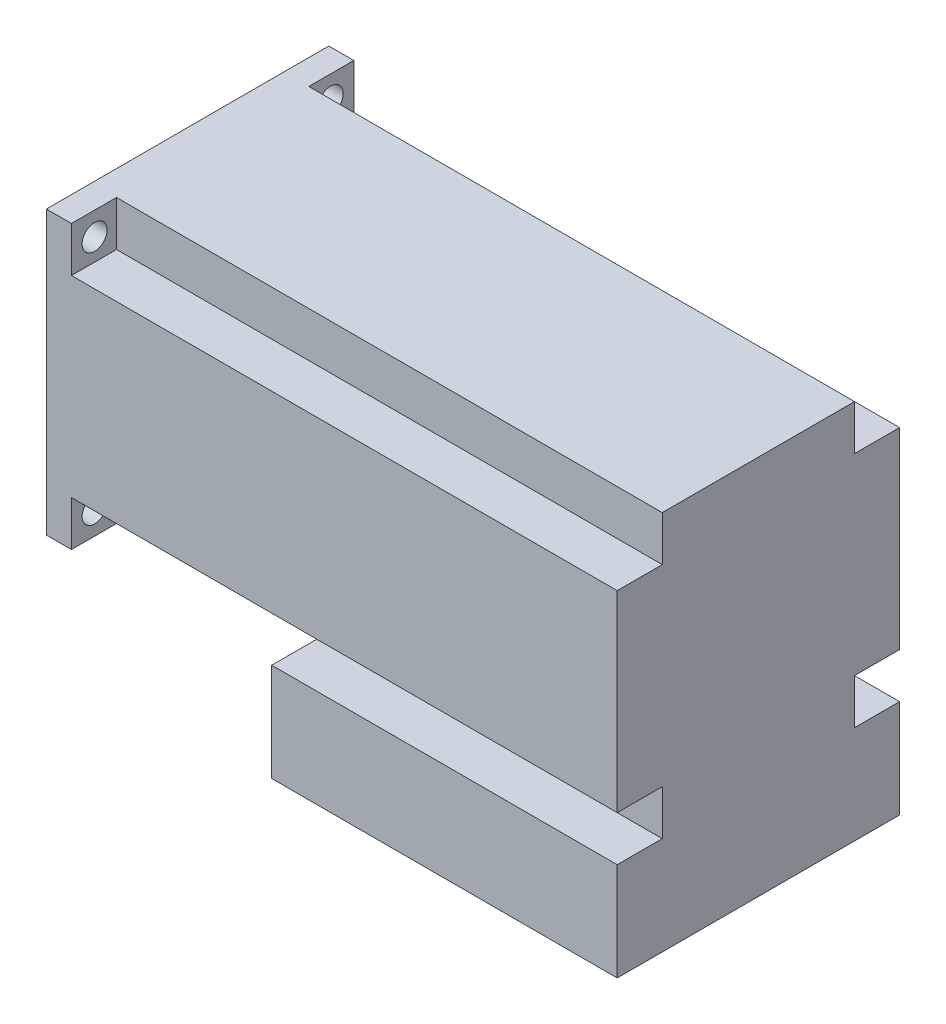
ISO-10303-21;
HEADER;
FILE_DESCRIPTION(('STEP AP214'),'2;1');
FILE_NAME('part.step','',(''),(''),'','','');
FILE_SCHEMA(('AUTOMOTIVE_DESIGN { 1 0 10303 214 1 1 1 1 }'));
ENDSEC;
DATA;
#1=APPLICATION_CONTEXT('core data for automotive mechanical design processes');
#2=APPLICATION_PROTOCOL_DEFINITION('international standard','automotive_design',2000,#1);
#3=PRODUCT_CONTEXT('',#1,'mechanical');
#4=PRODUCT('Part','Part','',(#3));
#5=PRODUCT_RELATED_PRODUCT_CATEGORY('part','',(#4));
#6=PRODUCT_DEFINITION_FORMATION('','',#4);
#7=PRODUCT_DEFINITION_CONTEXT('part definition',#1,'design');
#8=PRODUCT_DEFINITION('design','',#6,#7);
#9=PRODUCT_DEFINITION_SHAPE('','',#8);
#10=(LENGTH_UNIT() NAMED_UNIT(*) SI_UNIT(.MILLI.,.METRE.));
#11=(NAMED_UNIT(*) PLANE_ANGLE_UNIT() SI_UNIT($,.RADIAN.));
#12=(NAMED_UNIT(*) SI_UNIT($,.STERADIAN.) SOLID_ANGLE_UNIT());
#13=UNCERTAINTY_MEASURE_WITH_UNIT(LENGTH_MEASURE(1.E-05),#10,'distance_accuracy_value','');
#14=(GEOMETRIC_REPRESENTATION_CONTEXT(3) GLOBAL_UNCERTAINTY_ASSIGNED_CONTEXT((#13)) GLOBAL_UNIT_ASSIGNED_CONTEXT((#10,
#11,#12)) REPRESENTATION_CONTEXT('',''));
#15=CARTESIAN_POINT('',(0.,0.,0.));
#16=DIRECTION('',(0.,0.,1.));
#17=DIRECTION('',(1.,0.,0.));
#18=AXIS2_PLACEMENT_3D('',#15,#16,#17);
#19=CARTESIAN_POINT('',(0.,0.,56.4));
#20=DIRECTION('',(0.,0.,-1.));
#21=DIRECTION('',(-1.,0.,0.));
#22=AXIS2_PLACEMENT_3D('',#19,#20,#21);
#23=PLANE('',#22);
#24=DIRECTION('',(0.,1.,0.));
#25=VECTOR('',#24,1.);
#26=CARTESIAN_POINT('',(114.,-19.6,56.4));
#27=LINE('',#26,#25);
#28=CARTESIAN_POINT('',(114.,-19.6,56.4));
#29=VERTEX_POINT('',#28);
#30=CARTESIAN_POINT('',(114.,0.,56.3999999999995));
#31=VERTEX_POINT('',#30);
#32=EDGE_CURVE('E379',#29,#31,#27,.T.);
#33=ORIENTED_EDGE('',*,*,#32,.T.);
#34=DIRECTION('',(-1.,0.,0.));
#35=VECTOR('',#34,1.);
#36=CARTESIAN_POINT('',(0.,0.,56.4));
#37=LINE('',#36,#35);
#38=CARTESIAN_POINT('',(45.,0.,56.3999999999995));
#39=VERTEX_POINT('',#38);
#40=EDGE_CURVE('E11',#31,#39,#37,.T.);
#41=ORIENTED_EDGE('',*,*,#40,.T.);
#42=DIRECTION('',(0.,-1.,0.));
#43=VECTOR('',#42,1.);
#44=CARTESIAN_POINT('',(45.,0.,56.4));
#45=LINE('',#44,#43);
#46=CARTESIAN_POINT('',(45.,-19.6,56.4));
#47=VERTEX_POINT('',#46);
#48=EDGE_CURVE('E372',#39,#47,#45,.T.);
#49=ORIENTED_EDGE('',*,*,#48,.T.);
#50=DIRECTION('',(1.,0.,0.));
#51=VECTOR('',#50,1.);
#52=CARTESIAN_POINT('',(45.,-19.6,56.4));
#53=LINE('',#52,#51);
#54=EDGE_CURVE('E375',#47,#29,#53,.T.);
#55=ORIENTED_EDGE('',*,*,#54,.T.);
#56=EDGE_LOOP('',(#33,#41,#49,#55));
#57=FACE_BOUND('',#56,.T.);
#58=ADVANCED_FACE('F39',(#57),#23,.F.);
#59=CARTESIAN_POINT('',(0.,0.,0.));
#60=DIRECTION('',(0.,0.,-1.));
#61=DIRECTION('',(-1.,0.,0.));
#62=AXIS2_PLACEMENT_3D('',#59,#60,#61);
#63=PLANE('',#62);
#64=DIRECTION('',(-1.,0.,0.));
#65=VECTOR('',#64,1.);
#66=CARTESIAN_POINT('',(0.,0.,0.));
#67=LINE('',#66,#65);
#68=CARTESIAN_POINT('',(114.,0.,-4.92661467177413E-13));
#69=VERTEX_POINT('',#68);
#70=CARTESIAN_POINT('',(45.,0.,-4.92661467177413E-13));
#71=VERTEX_POINT('',#70);
#72=EDGE_CURVE('E48',#69,#71,#67,.T.);
#73=ORIENTED_EDGE('',*,*,#72,.F.);
#74=DIRECTION('',(0.,1.,0.));
#75=VECTOR('',#74,1.);
#76=CARTESIAN_POINT('',(114.,0.,0.));
#77=LINE('',#76,#75);
#78=CARTESIAN_POINT('',(114.,-19.6,0.));
#79=VERTEX_POINT('',#78);
#80=EDGE_CURVE('E402',#79,#69,#77,.T.);
#81=ORIENTED_EDGE('',*,*,#80,.F.);
#82=DIRECTION('',(1.,0.,0.));
#83=VECTOR('',#82,1.);
#84=CARTESIAN_POINT('',(45.,-19.6,0.));
#85=LINE('',#84,#83);
#86=CARTESIAN_POINT('',(45.,-19.6,0.));
#87=VERTEX_POINT('',#86);
#88=EDGE_CURVE('E397',#87,#79,#85,.T.);
#89=ORIENTED_EDGE('',*,*,#88,.F.);
#90=DIRECTION('',(0.,-1.,0.));
#91=VECTOR('',#90,1.);
#92=CARTESIAN_POINT('',(45.,0.,0.));
#93=LINE('',#92,#91);
#94=EDGE_CURVE('E394',#71,#87,#93,.T.);
#95=ORIENTED_EDGE('',*,*,#94,.F.);
#96=EDGE_LOOP('',(#73,#81,#89,#95));
#97=FACE_BOUND('',#96,.T.);
#98=ADVANCED_FACE('F447',(#97),#63,.T.);
#99=CARTESIAN_POINT('',(0.,0.,56.4));
#100=DIRECTION('',(1.,0.,0.));
#101=DIRECTION('',(0.,0.,-1.));
#102=AXIS2_PLACEMENT_3D('',#99,#100,#101);
#103=PLANE('',#102);
#104=CARTESIAN_POINT('',(0.,28.2,28.2));
#105=DIRECTION('',(1.,0.,0.));
#106=DIRECTION('',(0.,0.,-1.));
#107=AXIS2_PLACEMENT_3D('',#104,#105,#106);
#108=CIRCLE('',#107,3.175);
#109=CARTESIAN_POINT('',(0.,28.2,25.025));
#110=VERTEX_POINT('',#109);
#111=EDGE_CURVE('E430',#110,#110,#108,.F.);
#112=ORIENTED_EDGE('',*,*,#111,.F.);
#113=EDGE_LOOP('',(#112));
#114=FACE_BOUND('',#113,.T.);
#115=CARTESIAN_POINT('',(0.,51.77,4.62999999999984));
#116=DIRECTION('',(-1.,0.,0.));
#117=DIRECTION('',(0.,0.,1.));
#118=AXIS2_PLACEMENT_3D('',#115,#116,#117);
#119=CIRCLE('',#118,2.5);
#120=CARTESIAN_POINT('',(0.,51.77,7.12999999999984));
#121=VERTEX_POINT('',#120);
#122=EDGE_CURVE('E333',#121,#121,#119,.T.);
#123=ORIENTED_EDGE('',*,*,#122,.F.);
#124=EDGE_LOOP('',(#123));
#125=FACE_BOUND('',#124,.T.);
#126=CARTESIAN_POINT('',(0.,51.77,51.7699999999998));
#127=DIRECTION('',(-1.,0.,0.));
#128=DIRECTION('',(0.,0.,1.));
#129=AXIS2_PLACEMENT_3D('',#126,#127,#128);
#130=CIRCLE('',#129,2.5);
#131=CARTESIAN_POINT('',(0.,51.77,54.2699999999998));
#132=VERTEX_POINT('',#131);
#133=EDGE_CURVE('E343',#132,#132,#130,.T.);
#134=ORIENTED_EDGE('',*,*,#133,.F.);
#135=EDGE_LOOP('',(#134));
#136=FACE_BOUND('',#135,.T.);
#137=CARTESIAN_POINT('',(0.,4.63,51.77));
#138=DIRECTION('',(-1.,0.,0.));
#139=DIRECTION('',(0.,0.,1.));
#140=AXIS2_PLACEMENT_3D('',#137,#138,#139);
#141=CIRCLE('',#140,2.5);
#142=CARTESIAN_POINT('',(0.,4.63,54.27));
#143=VERTEX_POINT('',#142);
#144=EDGE_CURVE('E338',#143,#143,#141,.T.);
#145=ORIENTED_EDGE('',*,*,#144,.F.);
#146=EDGE_LOOP('',(#145));
#147=FACE_BOUND('',#146,.T.);
#148=CARTESIAN_POINT('',(0.,4.63,4.63));
#149=DIRECTION('',(-1.,0.,0.));
#150=DIRECTION('',(0.,0.,1.));
#151=AXIS2_PLACEMENT_3D('',#148,#149,#150);
#152=CIRCLE('',#151,2.5);
#153=CARTESIAN_POINT('',(0.,4.63,7.13000000000001));
#154=VERTEX_POINT('',#153);
#155=EDGE_CURVE('E342',#154,#154,#152,.T.);
#156=ORIENTED_EDGE('',*,*,#155,.F.);
#157=EDGE_LOOP('',(#156));
#158=FACE_BOUND('',#157,.T.);
#159=DIRECTION('',(0.,-1.,0.));
#160=VECTOR('',#159,1.);
#161=CARTESIAN_POINT('',(0.,0.,0.));
#162=LINE('',#161,#160);
#163=CARTESIAN_POINT('',(0.,56.4,0.));
#164=VERTEX_POINT('',#163);
#165=CARTESIAN_POINT('',(0.,0.,0.));
#166=VERTEX_POINT('',#165);
#167=EDGE_CURVE('E362',#164,#166,#162,.T.);
#168=ORIENTED_EDGE('',*,*,#167,.T.);
#169=DIRECTION('',(0.,0.,-1.));
#170=VECTOR('',#169,1.);
#171=CARTESIAN_POINT('',(0.,0.,56.4));
#172=LINE('',#171,#170);
#173=CARTESIAN_POINT('',(0.,0.,56.4));
#174=VERTEX_POINT('',#173);
#175=EDGE_CURVE('E426',#174,#166,#172,.T.);
#176=ORIENTED_EDGE('',*,*,#175,.F.);
#177=DIRECTION('',(0.,-1.,0.));
#178=VECTOR('',#177,1.);
#179=CARTESIAN_POINT('',(0.,0.,56.4));
#180=LINE('',#179,#178);
#181=CARTESIAN_POINT('',(0.,56.4,56.4));
#182=VERTEX_POINT('',#181);
#183=EDGE_CURVE('E363',#182,#174,#180,.T.);
#184=ORIENTED_EDGE('',*,*,#183,.F.);
#185=DIRECTION('',(0.,0.,-1.));
#186=VECTOR('',#185,1.);
#187=CARTESIAN_POINT('',(0.,56.4,56.4));
#188=LINE('',#187,#186);
#189=EDGE_CURVE('E386',#182,#164,#188,.T.);
#190=ORIENTED_EDGE('',*,*,#189,.T.);
#191=EDGE_LOOP('',(#168,#176,#184,#190));
#192=FACE_BOUND('',#191,.T.);
#193=ADVANCED_FACE('F41',(#114,#125,#136,#147,#158,#192),#103,.F.);
#194=CARTESIAN_POINT('',(0.,0.,56.4));
#195=DIRECTION('',(0.,1.,0.));
#196=DIRECTION('',(0.,0.,1.));
#197=AXIS2_PLACEMENT_3D('',#194,#195,#196);
#198=PLANE('',#197);
#199=DIRECTION('',(0.,0.,-1.));
#200=VECTOR('',#199,1.);
#201=CARTESIAN_POINT('',(45.,0.,56.4));
#202=LINE('',#201,#200);
#203=CARTESIAN_POINT('',(45.,0.,47.3999999999995));
#204=VERTEX_POINT('',#203);
#205=CARTESIAN_POINT('',(45.,0.,8.99999999999951));
#206=VERTEX_POINT('',#205);
#207=EDGE_CURVE('E421',#204,#206,#202,.T.);
#208=ORIENTED_EDGE('',*,*,#207,.F.);
#209=DIRECTION('',(1.,0.,0.));
#210=VECTOR('',#209,1.);
#211=CARTESIAN_POINT('',(5.,0.,47.3999999999995));
#212=LINE('',#211,#210);
#213=CARTESIAN_POINT('',(5.,0.,47.3999999999995));
#214=VERTEX_POINT('',#213);
#215=EDGE_CURVE('E286',#214,#204,#212,.T.);
#216=ORIENTED_EDGE('',*,*,#215,.F.);
#217=DIRECTION('',(0.,0.,-1.));
#218=VECTOR('',#217,1.);
#219=CARTESIAN_POINT('',(5.,0.,56.3999999999995));
#220=LINE('',#219,#218);
#221=CARTESIAN_POINT('',(5.,0.,56.3999999999995));
#222=VERTEX_POINT('',#221);
#223=EDGE_CURVE('E267',#222,#214,#220,.T.);
#224=ORIENTED_EDGE('',*,*,#223,.F.);
#225=DIRECTION('',(1.,0.,0.));
#226=VECTOR('',#225,1.);
#227=CARTESIAN_POINT('',(0.,0.,56.4));
#228=LINE('',#227,#226);
#229=EDGE_CURVE('E367',#174,#222,#228,.T.);
#230=ORIENTED_EDGE('',*,*,#229,.F.);
#231=ORIENTED_EDGE('',*,*,#175,.T.);
#232=DIRECTION('',(1.,0.,0.));
#233=VECTOR('',#232,1.);
#234=CARTESIAN_POINT('',(0.,0.,0.));
#235=LINE('',#234,#233);
#236=CARTESIAN_POINT('',(5.,0.,0.));
#237=VERTEX_POINT('',#236);
#238=EDGE_CURVE('E390',#166,#237,#235,.T.);
#239=ORIENTED_EDGE('',*,*,#238,.T.);
#240=DIRECTION('',(0.,0.,-1.));
#241=VECTOR('',#240,1.);
#242=CARTESIAN_POINT('',(5.,0.,8.99999999999951));
#243=LINE('',#242,#241);
#244=CARTESIAN_POINT('',(5.,0.,8.99999999999951));
#245=VERTEX_POINT('',#244);
#246=EDGE_CURVE('E231',#245,#237,#243,.T.);
#247=ORIENTED_EDGE('',*,*,#246,.F.);
#248=DIRECTION('',(1.,0.,0.));
#249=VECTOR('',#248,1.);
#250=CARTESIAN_POINT('',(5.,0.,8.99999999999951));
#251=LINE('',#250,#249);
#252=EDGE_CURVE('E254',#245,#206,#251,.T.);
#253=ORIENTED_EDGE('',*,*,#252,.T.);
#254=EDGE_LOOP('',(#208,#216,#224,#230,#231,#239,#247,#253));
#255=FACE_BOUND('',#254,.T.);
#256=ADVANCED_FACE('F469',(#255),#198,.F.);
#257=CARTESIAN_POINT('',(45.,0.,56.4));
#258=DIRECTION('',(1.,0.,0.));
#259=DIRECTION('',(0.,0.,-1.));
#260=AXIS2_PLACEMENT_3D('',#257,#258,#259);
#261=PLANE('',#260);
#262=ORIENTED_EDGE('',*,*,#94,.T.);
#263=DIRECTION('',(0.,0.,-1.));
#264=VECTOR('',#263,1.);
#265=CARTESIAN_POINT('',(45.,-19.6,56.4));
#266=LINE('',#265,#264);
#267=EDGE_CURVE('E417',#47,#87,#266,.T.);
#268=ORIENTED_EDGE('',*,*,#267,.F.);
#269=ORIENTED_EDGE('',*,*,#48,.F.);
#270=EDGE_CURVE('E422',#39,#204,#202,.T.);
#271=ORIENTED_EDGE('',*,*,#270,.T.);
#272=ORIENTED_EDGE('',*,*,#207,.T.);
#273=DIRECTION('',(0.,0.,-1.));
#274=VECTOR('',#273,1.);
#275=CARTESIAN_POINT('',(45.,0.,56.4));
#276=LINE('',#275,#274);
#277=EDGE_CURVE('E323',#206,#71,#276,.T.);
#278=ORIENTED_EDGE('',*,*,#277,.T.);
#279=EDGE_LOOP('',(#262,#268,#269,#271,#272,#278));
#280=FACE_BOUND('',#279,.T.);
#281=ADVANCED_FACE('F443',(#280),#261,.F.);
#282=CARTESIAN_POINT('',(45.,-19.6,56.4));
#283=DIRECTION('',(0.,1.,0.));
#284=DIRECTION('',(0.,0.,1.));
#285=AXIS2_PLACEMENT_3D('',#282,#283,#284);
#286=PLANE('',#285);
#287=ORIENTED_EDGE('',*,*,#88,.T.);
#288=DIRECTION('',(0.,0.,-1.));
#289=VECTOR('',#288,1.);
#290=CARTESIAN_POINT('',(114.,-19.6,56.4));
#291=LINE('',#290,#289);
#292=EDGE_CURVE('E413',#29,#79,#291,.T.);
#293=ORIENTED_EDGE('',*,*,#292,.F.);
#294=ORIENTED_EDGE('',*,*,#54,.F.);
#295=ORIENTED_EDGE('',*,*,#267,.T.);
#296=EDGE_LOOP('',(#287,#293,#294,#295));
#297=FACE_BOUND('',#296,.T.);
#298=ADVANCED_FACE('F450',(#297),#286,.F.);
#299=CARTESIAN_POINT('',(114.,0.,56.4));
#300=DIRECTION('',(-1.,0.,0.));
#301=DIRECTION('',(0.,0.,1.));
#302=AXIS2_PLACEMENT_3D('',#299,#300,#301);
#303=PLANE('',#302);
#304=CARTESIAN_POINT('',(114.,9.,56.3999999999995));
#305=VERTEX_POINT('',#304);
#306=CARTESIAN_POINT('',(114.,47.4,56.4));
#307=VERTEX_POINT('',#306);
#308=EDGE_CURVE('E378',#305,#307,#27,.T.);
#309=ORIENTED_EDGE('',*,*,#308,.F.);
#310=DIRECTION('',(0.,0.,1.));
#311=VECTOR('',#310,1.);
#312=CARTESIAN_POINT('',(114.,9.,56.3999999999995));
#313=LINE('',#312,#311);
#314=CARTESIAN_POINT('',(114.,9.,47.3999999999995));
#315=VERTEX_POINT('',#314);
#316=EDGE_CURVE('E274',#315,#305,#313,.T.);
#317=ORIENTED_EDGE('',*,*,#316,.F.);
#318=DIRECTION('',(0.,1.,0.));
#319=VECTOR('',#318,1.);
#320=CARTESIAN_POINT('',(114.,9.,47.3999999999995));
#321=LINE('',#320,#319);
#322=CARTESIAN_POINT('',(114.,0.,47.3999999999995));
#323=VERTEX_POINT('',#322);
#324=EDGE_CURVE('E264',#323,#315,#321,.T.);
#325=ORIENTED_EDGE('',*,*,#324,.F.);
#326=DIRECTION('',(0.,0.,-1.));
#327=VECTOR('',#326,1.);
#328=CARTESIAN_POINT('',(114.,0.,56.3999999999995));
#329=LINE('',#328,#327);
#330=EDGE_CURVE('E277',#31,#323,#329,.T.);
#331=ORIENTED_EDGE('',*,*,#330,.F.);
#332=ORIENTED_EDGE('',*,*,#32,.F.);
#333=ORIENTED_EDGE('',*,*,#292,.T.);
#334=ORIENTED_EDGE('',*,*,#80,.T.);
#335=DIRECTION('',(0.,0.,-1.));
#336=VECTOR('',#335,1.);
#337=CARTESIAN_POINT('',(114.,0.,8.99999999999951));
#338=LINE('',#337,#336);
#339=CARTESIAN_POINT('',(114.,0.,8.99999999999951));
#340=VERTEX_POINT('',#339);
#341=EDGE_CURVE('E227',#340,#69,#338,.T.);
#342=ORIENTED_EDGE('',*,*,#341,.F.);
#343=DIRECTION('',(0.,-1.,0.));
#344=VECTOR('',#343,1.);
#345=CARTESIAN_POINT('',(114.,9.,8.99999999999951));
#346=LINE('',#345,#344);
#347=CARTESIAN_POINT('',(114.,9.,8.99999999999951));
#348=VERTEX_POINT('',#347);
#349=EDGE_CURVE('E243',#348,#340,#346,.T.);
#350=ORIENTED_EDGE('',*,*,#349,.F.);
#351=DIRECTION('',(0.,0.,1.));
#352=VECTOR('',#351,1.);
#353=CARTESIAN_POINT('',(114.,9.,8.99999999999951));
#354=LINE('',#353,#352);
#355=CARTESIAN_POINT('',(114.,9.,-4.92661467177413E-13));
#356=VERTEX_POINT('',#355);
#357=EDGE_CURVE('E239',#356,#348,#354,.T.);
#358=ORIENTED_EDGE('',*,*,#357,.F.);
#359=CARTESIAN_POINT('',(114.,47.4,0.));
#360=VERTEX_POINT('',#359);
#361=EDGE_CURVE('E401',#356,#360,#77,.T.);
#362=ORIENTED_EDGE('',*,*,#361,.T.);
#363=DIRECTION('',(0.,0.,-1.));
#364=VECTOR('',#363,1.);
#365=CARTESIAN_POINT('',(114.,47.4,9.));
#366=LINE('',#365,#364);
#367=CARTESIAN_POINT('',(114.,47.4,9.));
#368=VERTEX_POINT('',#367);
#369=EDGE_CURVE('E206',#368,#360,#366,.T.);
#370=ORIENTED_EDGE('',*,*,#369,.F.);
#371=DIRECTION('',(0.,-1.,0.));
#372=VECTOR('',#371,1.);
#373=CARTESIAN_POINT('',(114.,56.4,9.));
#374=LINE('',#373,#372);
#375=CARTESIAN_POINT('',(114.,56.4,9.));
#376=VERTEX_POINT('',#375);
#377=EDGE_CURVE('E253',#376,#368,#374,.T.);
#378=ORIENTED_EDGE('',*,*,#377,.F.);
#379=DIRECTION('',(0.,0.,-1.));
#380=VECTOR('',#379,1.);
#381=CARTESIAN_POINT('',(114.,56.4,56.4));
#382=LINE('',#381,#380);
#383=CARTESIAN_POINT('',(114.,56.4,47.4));
#384=VERTEX_POINT('',#383);
#385=EDGE_CURVE('E212',#384,#376,#382,.T.);
#386=ORIENTED_EDGE('',*,*,#385,.F.);
#387=DIRECTION('',(0.,1.,0.));
#388=VECTOR('',#387,1.);
#389=CARTESIAN_POINT('',(114.,56.4,47.4));
#390=LINE('',#389,#388);
#391=CARTESIAN_POINT('',(114.,47.4,47.4));
#392=VERTEX_POINT('',#391);
#393=EDGE_CURVE('E298',#392,#384,#390,.T.);
#394=ORIENTED_EDGE('',*,*,#393,.F.);
#395=DIRECTION('',(0.,0.,-1.));
#396=VECTOR('',#395,1.);
#397=CARTESIAN_POINT('',(114.,47.4,56.4));
#398=LINE('',#397,#396);
#399=EDGE_CURVE('E308',#307,#392,#398,.T.);
#400=ORIENTED_EDGE('',*,*,#399,.F.);
#401=EDGE_LOOP('',(#309,#317,#325,#331,#332,#333,#334,#342,#350,#358,#362,#370,#378,#386,#394,#400));
#402=FACE_BOUND('',#401,.T.);
#403=ADVANCED_FACE('F455',(#402),#303,.F.);
#404=CARTESIAN_POINT('',(0.,56.4,56.4));
#405=DIRECTION('',(0.,-1.,0.));
#406=DIRECTION('',(0.,0.,-1.));
#407=AXIS2_PLACEMENT_3D('',#404,#405,#406);
#408=PLANE('',#407);
#409=ORIENTED_EDGE('',*,*,#385,.T.);
#410=DIRECTION('',(1.,0.,0.));
#411=VECTOR('',#410,1.);
#412=CARTESIAN_POINT('',(5.,56.4,9.));
#413=LINE('',#412,#411);
#414=CARTESIAN_POINT('',(5.,56.4,9.));
#415=VERTEX_POINT('',#414);
#416=EDGE_CURVE('E190',#415,#376,#413,.T.);
#417=ORIENTED_EDGE('',*,*,#416,.F.);
#418=DIRECTION('',(0.,0.,1.));
#419=VECTOR('',#418,1.);
#420=CARTESIAN_POINT('',(5.,56.4,9.));
#421=LINE('',#420,#419);
#422=CARTESIAN_POINT('',(5.,56.4,0.));
#423=VERTEX_POINT('',#422);
#424=EDGE_CURVE('E197',#423,#415,#421,.T.);
#425=ORIENTED_EDGE('',*,*,#424,.F.);
#426=DIRECTION('',(-1.,0.,0.));
#427=VECTOR('',#426,1.);
#428=CARTESIAN_POINT('',(0.,56.4,0.));
#429=LINE('',#428,#427);
#430=EDGE_CURVE('E368',#423,#164,#429,.T.);
#431=ORIENTED_EDGE('',*,*,#430,.T.);
#432=ORIENTED_EDGE('',*,*,#189,.F.);
#433=DIRECTION('',(-1.,0.,0.));
#434=VECTOR('',#433,1.);
#435=CARTESIAN_POINT('',(0.,56.4,56.4));
#436=LINE('',#435,#434);
#437=CARTESIAN_POINT('',(5.,56.4,56.4));
#438=VERTEX_POINT('',#437);
#439=EDGE_CURVE('E383',#438,#182,#436,.T.);
#440=ORIENTED_EDGE('',*,*,#439,.F.);
#441=DIRECTION('',(0.,0.,1.));
#442=VECTOR('',#441,1.);
#443=CARTESIAN_POINT('',(5.,56.4,56.4));
#444=LINE('',#443,#442);
#445=CARTESIAN_POINT('',(5.,56.4,47.4));
#446=VERTEX_POINT('',#445);
#447=EDGE_CURVE('E63',#446,#438,#444,.T.);
#448=ORIENTED_EDGE('',*,*,#447,.F.);
#449=DIRECTION('',(1.,0.,0.));
#450=VECTOR('',#449,1.);
#451=CARTESIAN_POINT('',(5.,56.4,47.4));
#452=LINE('',#451,#450);
#453=EDGE_CURVE('E314',#446,#384,#452,.T.);
#454=ORIENTED_EDGE('',*,*,#453,.T.);
#455=EDGE_LOOP('',(#409,#417,#425,#431,#432,#440,#448,#454));
#456=FACE_BOUND('',#455,.T.);
#457=ADVANCED_FACE('F209',(#456),#408,.F.);
#458=DIRECTION('',(0.,-1.,0.));
#459=VECTOR('',#458,1.);
#460=CARTESIAN_POINT('',(5.,9.,56.3999999999995));
#461=LINE('',#460,#459);
#462=CARTESIAN_POINT('',(5.,9.,56.4));
#463=VERTEX_POINT('',#462);
#464=EDGE_CURVE('E263',#463,#222,#461,.T.);
#465=ORIENTED_EDGE('',*,*,#464,.F.);
#466=DIRECTION('',(1.,0.,0.));
#467=VECTOR('',#466,1.);
#468=CARTESIAN_POINT('',(5.,9.,56.3999999999995));
#469=LINE('',#468,#467);
#470=EDGE_CURVE('E273',#463,#305,#469,.T.);
#471=ORIENTED_EDGE('',*,*,#470,.T.);
#472=ORIENTED_EDGE('',*,*,#308,.T.);
#473=DIRECTION('',(1.,0.,0.));
#474=VECTOR('',#473,1.);
#475=CARTESIAN_POINT('',(5.,47.4,56.4));
#476=LINE('',#475,#474);
#477=CARTESIAN_POINT('',(5.,47.4,56.4));
#478=VERTEX_POINT('',#477);
#479=EDGE_CURVE('E307',#478,#307,#476,.T.);
#480=ORIENTED_EDGE('',*,*,#479,.F.);
#481=DIRECTION('',(0.,-1.,0.));
#482=VECTOR('',#481,1.);
#483=CARTESIAN_POINT('',(5.,56.4,56.4));
#484=LINE('',#483,#482);
#485=EDGE_CURVE('E294',#438,#478,#484,.T.);
#486=ORIENTED_EDGE('',*,*,#485,.F.);
#487=ORIENTED_EDGE('',*,*,#439,.T.);
#488=ORIENTED_EDGE('',*,*,#183,.T.);
#489=ORIENTED_EDGE('',*,*,#229,.T.);
#490=EDGE_LOOP('',(#465,#471,#472,#480,#486,#487,#488,#489));
#491=FACE_BOUND('',#490,.T.);
#492=ADVANCED_FACE('F500',(#491),#23,.F.);
#493=DIRECTION('',(1.,0.,0.));
#494=VECTOR('',#493,1.);
#495=CARTESIAN_POINT('',(5.,9.,-4.92661467177413E-13));
#496=LINE('',#495,#494);
#497=CARTESIAN_POINT('',(5.,9.,-4.92661467177413E-13));
#498=VERTEX_POINT('',#497);
#499=EDGE_CURVE('E250',#498,#356,#496,.T.);
#500=ORIENTED_EDGE('',*,*,#499,.F.);
#501=DIRECTION('',(0.,1.,0.));
#502=VECTOR('',#501,1.);
#503=CARTESIAN_POINT('',(5.,9.,-4.92661467177413E-13));
#504=LINE('',#503,#502);
#505=EDGE_CURVE('E234',#237,#498,#504,.T.);
#506=ORIENTED_EDGE('',*,*,#505,.F.);
#507=ORIENTED_EDGE('',*,*,#238,.F.);
#508=ORIENTED_EDGE('',*,*,#167,.F.);
#509=ORIENTED_EDGE('',*,*,#430,.F.);
#510=DIRECTION('',(0.,1.,0.));
#511=VECTOR('',#510,1.);
#512=CARTESIAN_POINT('',(5.,56.4,0.));
#513=LINE('',#512,#511);
#514=CARTESIAN_POINT('',(5.,47.4,0.));
#515=VERTEX_POINT('',#514);
#516=EDGE_CURVE('E202',#515,#423,#513,.T.);
#517=ORIENTED_EDGE('',*,*,#516,.F.);
#518=DIRECTION('',(1.,0.,0.));
#519=VECTOR('',#518,1.);
#520=CARTESIAN_POINT('',(5.,47.4,0.));
#521=LINE('',#520,#519);
#522=EDGE_CURVE('E217',#515,#360,#521,.T.);
#523=ORIENTED_EDGE('',*,*,#522,.T.);
#524=ORIENTED_EDGE('',*,*,#361,.F.);
#525=EDGE_LOOP('',(#500,#506,#507,#508,#509,#517,#523,#524));
#526=FACE_BOUND('',#525,.T.);
#527=ADVANCED_FACE('F491',(#526),#63,.T.);
#528=CARTESIAN_POINT('',(5.,4.63,4.63));
#529=DIRECTION('',(-1.,0.,0.));
#530=DIRECTION('',(0.,0.,1.));
#531=AXIS2_PLACEMENT_3D('',#528,#529,#530);
#532=CYLINDRICAL_SURFACE('',#531,2.5);
#533=CARTESIAN_POINT('',(5.,4.63,4.63));
#534=DIRECTION('',(-1.,0.,0.));
#535=DIRECTION('',(0.,0.,1.));
#536=AXIS2_PLACEMENT_3D('',#533,#534,#535);
#537=CIRCLE('',#536,2.5);
#538=CARTESIAN_POINT('',(5.,4.63,7.13000000000001));
#539=VERTEX_POINT('',#538);
#540=EDGE_CURVE('E328',#539,#539,#537,.T.);
#541=ORIENTED_EDGE('',*,*,#540,.F.);
#542=EDGE_LOOP('',(#541));
#543=FACE_BOUND('',#542,.T.);
#544=ORIENTED_EDGE('',*,*,#155,.T.);
#545=EDGE_LOOP('',(#544));
#546=FACE_BOUND('',#545,.T.);
#547=ADVANCED_FACE('F541',(#543,#546),#532,.F.);
#548=CARTESIAN_POINT('',(5.,4.63,51.77));
#549=DIRECTION('',(-1.,0.,0.));
#550=DIRECTION('',(0.,0.,1.));
#551=AXIS2_PLACEMENT_3D('',#548,#549,#550);
#552=CYLINDRICAL_SURFACE('',#551,2.5);
#553=CARTESIAN_POINT('',(5.,4.63,51.77));
#554=DIRECTION('',(-1.,0.,0.));
#555=DIRECTION('',(0.,0.,1.));
#556=AXIS2_PLACEMENT_3D('',#553,#554,#555);
#557=CIRCLE('',#556,2.5);
#558=CARTESIAN_POINT('',(5.,4.63,54.27));
#559=VERTEX_POINT('',#558);
#560=EDGE_CURVE('E334',#559,#559,#557,.T.);
#561=ORIENTED_EDGE('',*,*,#560,.F.);
#562=EDGE_LOOP('',(#561));
#563=FACE_BOUND('',#562,.T.);
#564=ORIENTED_EDGE('',*,*,#144,.T.);
#565=EDGE_LOOP('',(#564));
#566=FACE_BOUND('',#565,.T.);
#567=ADVANCED_FACE('F530',(#563,#566),#552,.F.);
#568=CARTESIAN_POINT('',(5.,51.77,51.7699999999998));
#569=DIRECTION('',(-1.,0.,0.));
#570=DIRECTION('',(0.,0.,1.));
#571=AXIS2_PLACEMENT_3D('',#568,#569,#570);
#572=CYLINDRICAL_SURFACE('',#571,2.5);
#573=CARTESIAN_POINT('',(5.,51.77,51.7699999999998));
#574=DIRECTION('',(-1.,0.,0.));
#575=DIRECTION('',(0.,0.,1.));
#576=AXIS2_PLACEMENT_3D('',#573,#574,#575);
#577=CIRCLE('',#576,2.5);
#578=CARTESIAN_POINT('',(5.,51.77,54.2699999999998));
#579=VERTEX_POINT('',#578);
#580=EDGE_CURVE('E327',#579,#579,#577,.T.);
#581=ORIENTED_EDGE('',*,*,#580,.F.);
#582=EDGE_LOOP('',(#581));
#583=FACE_BOUND('',#582,.T.);
#584=ORIENTED_EDGE('',*,*,#133,.T.);
#585=EDGE_LOOP('',(#584));
#586=FACE_BOUND('',#585,.T.);
#587=ADVANCED_FACE('F526',(#583,#586),#572,.F.);
#588=CARTESIAN_POINT('',(5.,51.77,4.62999999999984));
#589=DIRECTION('',(-1.,0.,0.));
#590=DIRECTION('',(0.,0.,1.));
#591=AXIS2_PLACEMENT_3D('',#588,#589,#590);
#592=CYLINDRICAL_SURFACE('',#591,2.5);
#593=CARTESIAN_POINT('',(5.,51.77,4.62999999999984));
#594=DIRECTION('',(-1.,0.,0.));
#595=DIRECTION('',(0.,0.,1.));
#596=AXIS2_PLACEMENT_3D('',#593,#594,#595);
#597=CIRCLE('',#596,2.5);
#598=CARTESIAN_POINT('',(5.,51.77,7.12999999999984));
#599=VERTEX_POINT('',#598);
#600=EDGE_CURVE('E317',#599,#599,#597,.T.);
#601=ORIENTED_EDGE('',*,*,#600,.F.);
#602=EDGE_LOOP('',(#601));
#603=FACE_BOUND('',#602,.T.);
#604=ORIENTED_EDGE('',*,*,#122,.T.);
#605=EDGE_LOOP('',(#604));
#606=FACE_BOUND('',#605,.T.);
#607=ADVANCED_FACE('F529',(#603,#606),#592,.F.);
#608=CARTESIAN_POINT('',(-20.,28.2,28.2));
#609=DIRECTION('',(1.,0.,0.));
#610=DIRECTION('',(0.,0.,-1.));
#611=AXIS2_PLACEMENT_3D('',#608,#609,#610);
#612=CYLINDRICAL_SURFACE('',#611,3.175);
#613=CARTESIAN_POINT('',(-20.,28.2,28.2));
#614=DIRECTION('',(-1.,0.,0.));
#615=DIRECTION('',(0.,0.,1.));
#616=AXIS2_PLACEMENT_3D('',#613,#614,#615);
#617=CIRCLE('',#616,3.175);
#618=CARTESIAN_POINT('',(-20.,28.2,31.375));
#619=VERTEX_POINT('',#618);
#620=EDGE_CURVE('E329',#619,#619,#617,.T.);
#621=ORIENTED_EDGE('',*,*,#620,.F.);
#622=EDGE_LOOP('',(#621));
#623=FACE_BOUND('',#622,.T.);
#624=ORIENTED_EDGE('',*,*,#111,.T.);
#625=EDGE_LOOP('',(#624));
#626=FACE_BOUND('',#625,.T.);
#627=ADVANCED_FACE('F731',(#623,#626),#612,.T.);
#628=CARTESIAN_POINT('',(-20.,28.2,28.2));
#629=DIRECTION('',(-1.,0.,0.));
#630=DIRECTION('',(0.,0.,1.));
#631=AXIS2_PLACEMENT_3D('',#628,#629,#630);
#632=PLANE('',#631);
#633=ORIENTED_EDGE('',*,*,#620,.T.);
#634=EDGE_LOOP('',(#633));
#635=FACE_BOUND('',#634,.T.);
#636=ADVANCED_FACE('F615',(#635),#632,.T.);
#637=CARTESIAN_POINT('',(5.,47.4,9.));
#638=DIRECTION('',(0.,-1.,0.));
#639=DIRECTION('',(0.,0.,-1.));
#640=AXIS2_PLACEMENT_3D('',#637,#638,#639);
#641=PLANE('',#640);
#642=ORIENTED_EDGE('',*,*,#369,.T.);
#643=ORIENTED_EDGE('',*,*,#522,.F.);
#644=DIRECTION('',(0.,0.,-1.));
#645=VECTOR('',#644,1.);
#646=CARTESIAN_POINT('',(5.,47.4,9.));
#647=LINE('',#646,#645);
#648=CARTESIAN_POINT('',(5.,47.4,9.));
#649=VERTEX_POINT('',#648);
#650=EDGE_CURVE('E196',#649,#515,#647,.T.);
#651=ORIENTED_EDGE('',*,*,#650,.F.);
#652=DIRECTION('',(1.,0.,0.));
#653=VECTOR('',#652,1.);
#654=CARTESIAN_POINT('',(5.,47.4,9.));
#655=LINE('',#654,#653);
#656=EDGE_CURVE('E192',#649,#368,#655,.T.);
#657=ORIENTED_EDGE('',*,*,#656,.T.);
#658=EDGE_LOOP('',(#642,#643,#651,#657));
#659=FACE_BOUND('',#658,.T.);
#660=ADVANCED_FACE('F488',(#659),#641,.F.);
#661=CARTESIAN_POINT('',(5.,56.4,9.));
#662=DIRECTION('',(0.,0.,1.));
#663=DIRECTION('',(1.,0.,0.));
#664=AXIS2_PLACEMENT_3D('',#661,#662,#663);
#665=PLANE('',#664);
#666=ORIENTED_EDGE('',*,*,#377,.T.);
#667=ORIENTED_EDGE('',*,*,#656,.F.);
#668=DIRECTION('',(0.,-1.,0.));
#669=VECTOR('',#668,1.);
#670=CARTESIAN_POINT('',(5.,56.4,9.));
#671=LINE('',#670,#669);
#672=EDGE_CURVE('E185',#415,#649,#671,.T.);
#673=ORIENTED_EDGE('',*,*,#672,.F.);
#674=ORIENTED_EDGE('',*,*,#416,.T.);
#675=EDGE_LOOP('',(#666,#667,#673,#674));
#676=FACE_BOUND('',#675,.T.);
#677=ADVANCED_FACE('F188',(#676),#665,.F.);
#678=CARTESIAN_POINT('',(5.,0.,0.));
#679=DIRECTION('',(-1.,0.,0.));
#680=DIRECTION('',(0.,0.,1.));
#681=AXIS2_PLACEMENT_3D('',#678,#679,#680);
#682=PLANE('',#681);
#683=ORIENTED_EDGE('',*,*,#600,.T.);
#684=EDGE_LOOP('',(#683));
#685=FACE_BOUND('',#684,.T.);
#686=ORIENTED_EDGE('',*,*,#424,.T.);
#687=ORIENTED_EDGE('',*,*,#672,.T.);
#688=ORIENTED_EDGE('',*,*,#650,.T.);
#689=ORIENTED_EDGE('',*,*,#516,.T.);
#690=EDGE_LOOP('',(#686,#687,#688,#689));
#691=FACE_BOUND('',#690,.T.);
#692=ADVANCED_FACE('F200',(#685,#691),#682,.F.);
#693=CARTESIAN_POINT('',(5.,0.,8.99999999999951));
#694=DIRECTION('',(0.,-1.,0.));
#695=DIRECTION('',(0.,0.,-1.));
#696=AXIS2_PLACEMENT_3D('',#693,#694,#695);
#697=PLANE('',#696);
#698=EDGE_CURVE('E258',#206,#340,#251,.T.);
#699=ORIENTED_EDGE('',*,*,#698,.T.);
#700=ORIENTED_EDGE('',*,*,#341,.T.);
#701=ORIENTED_EDGE('',*,*,#72,.T.);
#702=ORIENTED_EDGE('',*,*,#277,.F.);
#703=EDGE_LOOP('',(#699,#700,#701,#702));
#704=FACE_BOUND('',#703,.T.);
#705=ADVANCED_FACE('F436',(#704),#697,.F.);
#706=CARTESIAN_POINT('',(5.,9.,8.99999999999951));
#707=DIRECTION('',(0.,1.,0.));
#708=DIRECTION('',(0.,0.,1.));
#709=AXIS2_PLACEMENT_3D('',#706,#707,#708);
#710=PLANE('',#709);
#711=ORIENTED_EDGE('',*,*,#357,.T.);
#712=DIRECTION('',(1.,0.,0.));
#713=VECTOR('',#712,1.);
#714=CARTESIAN_POINT('',(5.,9.,8.99999999999951));
#715=LINE('',#714,#713);
#716=CARTESIAN_POINT('',(5.,9.,8.99999999999951));
#717=VERTEX_POINT('',#716);
#718=EDGE_CURVE('E238',#717,#348,#715,.T.);
#719=ORIENTED_EDGE('',*,*,#718,.F.);
#720=DIRECTION('',(0.,0.,1.));
#721=VECTOR('',#720,1.);
#722=CARTESIAN_POINT('',(5.,9.,8.99999999999951));
#723=LINE('',#722,#721);
#724=EDGE_CURVE('E222',#498,#717,#723,.T.);
#725=ORIENTED_EDGE('',*,*,#724,.F.);
#726=ORIENTED_EDGE('',*,*,#499,.T.);
#727=EDGE_LOOP('',(#711,#719,#725,#726));
#728=FACE_BOUND('',#727,.T.);
#729=ADVANCED_FACE('F510',(#728),#710,.F.);
#730=CARTESIAN_POINT('',(5.,9.,8.99999999999951));
#731=DIRECTION('',(0.,0.,1.));
#732=DIRECTION('',(1.,0.,0.));
#733=AXIS2_PLACEMENT_3D('',#730,#731,#732);
#734=PLANE('',#733);
#735=ORIENTED_EDGE('',*,*,#349,.T.);
#736=ORIENTED_EDGE('',*,*,#698,.F.);
#737=ORIENTED_EDGE('',*,*,#252,.F.);
#738=DIRECTION('',(0.,-1.,0.));
#739=VECTOR('',#738,1.);
#740=CARTESIAN_POINT('',(5.,9.,8.99999999999951));
#741=LINE('',#740,#739);
#742=EDGE_CURVE('E226',#717,#245,#741,.T.);
#743=ORIENTED_EDGE('',*,*,#742,.F.);
#744=ORIENTED_EDGE('',*,*,#718,.T.);
#745=EDGE_LOOP('',(#735,#736,#737,#743,#744));
#746=FACE_BOUND('',#745,.T.);
#747=ADVANCED_FACE('F651',(#746),#734,.F.);
#748=CARTESIAN_POINT('',(5.,0.,0.));
#749=DIRECTION('',(-1.,0.,0.));
#750=DIRECTION('',(0.,0.,1.));
#751=AXIS2_PLACEMENT_3D('',#748,#749,#750);
#752=PLANE('',#751);
#753=ORIENTED_EDGE('',*,*,#540,.T.);
#754=EDGE_LOOP('',(#753));
#755=FACE_BOUND('',#754,.T.);
#756=ORIENTED_EDGE('',*,*,#724,.T.);
#757=ORIENTED_EDGE('',*,*,#742,.T.);
#758=ORIENTED_EDGE('',*,*,#246,.T.);
#759=ORIENTED_EDGE('',*,*,#505,.T.);
#760=EDGE_LOOP('',(#756,#757,#758,#759));
#761=FACE_BOUND('',#760,.T.);
#762=ADVANCED_FACE('F513',(#755,#761),#752,.F.);
#763=CARTESIAN_POINT('',(5.,0.,0.));
#764=DIRECTION('',(1.,0.,0.));
#765=DIRECTION('',(0.,0.,-1.));
#766=AXIS2_PLACEMENT_3D('',#763,#764,#765);
#767=PLANE('',#766);
#768=ORIENTED_EDGE('',*,*,#485,.T.);
#769=DIRECTION('',(0.,0.,-1.));
#770=VECTOR('',#769,1.);
#771=CARTESIAN_POINT('',(5.,47.4,56.4));
#772=LINE('',#771,#770);
#773=CARTESIAN_POINT('',(5.,47.4,47.4));
#774=VERTEX_POINT('',#773);
#775=EDGE_CURVE('E297',#478,#774,#772,.T.);
#776=ORIENTED_EDGE('',*,*,#775,.T.);
#777=DIRECTION('',(0.,1.,0.));
#778=VECTOR('',#777,1.);
#779=CARTESIAN_POINT('',(5.,56.4,47.4));
#780=LINE('',#779,#778);
#781=EDGE_CURVE('E302',#774,#446,#780,.T.);
#782=ORIENTED_EDGE('',*,*,#781,.T.);
#783=ORIENTED_EDGE('',*,*,#447,.T.);
#784=EDGE_LOOP('',(#768,#776,#782,#783));
#785=FACE_BOUND('',#784,.T.);
#786=ORIENTED_EDGE('',*,*,#580,.T.);
#787=EDGE_LOOP('',(#786));
#788=FACE_BOUND('',#787,.T.);
#789=ADVANCED_FACE('F519',(#785,#788),#767,.T.);
#790=CARTESIAN_POINT('',(5.,56.4,47.4));
#791=DIRECTION('',(0.,0.,-1.));
#792=DIRECTION('',(-1.,0.,0.));
#793=AXIS2_PLACEMENT_3D('',#790,#791,#792);
#794=PLANE('',#793);
#795=ORIENTED_EDGE('',*,*,#393,.T.);
#796=ORIENTED_EDGE('',*,*,#453,.F.);
#797=ORIENTED_EDGE('',*,*,#781,.F.);
#798=DIRECTION('',(1.,0.,0.));
#799=VECTOR('',#798,1.);
#800=CARTESIAN_POINT('',(5.,47.4,47.4));
#801=LINE('',#800,#799);
#802=EDGE_CURVE('E318',#774,#392,#801,.T.);
#803=ORIENTED_EDGE('',*,*,#802,.T.);
#804=EDGE_LOOP('',(#795,#796,#797,#803));
#805=FACE_BOUND('',#804,.T.);
#806=ADVANCED_FACE('F522',(#805),#794,.F.);
#807=CARTESIAN_POINT('',(5.,47.4,56.4));
#808=DIRECTION('',(0.,-1.,0.));
#809=DIRECTION('',(0.,0.,-1.));
#810=AXIS2_PLACEMENT_3D('',#807,#808,#809);
#811=PLANE('',#810);
#812=ORIENTED_EDGE('',*,*,#399,.T.);
#813=ORIENTED_EDGE('',*,*,#802,.F.);
#814=ORIENTED_EDGE('',*,*,#775,.F.);
#815=ORIENTED_EDGE('',*,*,#479,.T.);
#816=EDGE_LOOP('',(#812,#813,#814,#815));
#817=FACE_BOUND('',#816,.T.);
#818=ADVANCED_FACE('F518',(#817),#811,.F.);
#819=CARTESIAN_POINT('',(5.,0.,56.3999999999995));
#820=DIRECTION('',(0.,-1.,0.));
#821=DIRECTION('',(0.,0.,-1.));
#822=AXIS2_PLACEMENT_3D('',#819,#820,#821);
#823=PLANE('',#822);
#824=ORIENTED_EDGE('',*,*,#40,.F.);
#825=ORIENTED_EDGE('',*,*,#330,.T.);
#826=EDGE_CURVE('E290',#204,#323,#212,.T.);
#827=ORIENTED_EDGE('',*,*,#826,.F.);
#828=ORIENTED_EDGE('',*,*,#270,.F.);
#829=EDGE_LOOP('',(#824,#825,#827,#828));
#830=FACE_BOUND('',#829,.T.);
#831=ADVANCED_FACE('F461',(#830),#823,.F.);
#832=CARTESIAN_POINT('',(5.,9.,56.3999999999995));
#833=DIRECTION('',(0.,1.,0.));
#834=DIRECTION('',(0.,0.,1.));
#835=AXIS2_PLACEMENT_3D('',#832,#833,#834);
#836=PLANE('',#835);
#837=ORIENTED_EDGE('',*,*,#316,.T.);
#838=ORIENTED_EDGE('',*,*,#470,.F.);
#839=DIRECTION('',(0.,0.,1.));
#840=VECTOR('',#839,1.);
#841=CARTESIAN_POINT('',(5.,9.,56.3999999999995));
#842=LINE('',#841,#840);
#843=CARTESIAN_POINT('',(5.,9.,47.3999999999995));
#844=VERTEX_POINT('',#843);
#845=EDGE_CURVE('E55',#844,#463,#842,.T.);
#846=ORIENTED_EDGE('',*,*,#845,.F.);
#847=DIRECTION('',(1.,0.,0.));
#848=VECTOR('',#847,1.);
#849=CARTESIAN_POINT('',(5.,9.,47.3999999999995));
#850=LINE('',#849,#848);
#851=EDGE_CURVE('E244',#844,#315,#850,.T.);
#852=ORIENTED_EDGE('',*,*,#851,.T.);
#853=EDGE_LOOP('',(#837,#838,#846,#852));
#854=FACE_BOUND('',#853,.T.);
#855=ADVANCED_FACE('F700',(#854),#836,.F.);
#856=CARTESIAN_POINT('',(5.,9.,47.3999999999995));
#857=DIRECTION('',(0.,0.,-1.));
#858=DIRECTION('',(-1.,0.,0.));
#859=AXIS2_PLACEMENT_3D('',#856,#857,#858);
#860=PLANE('',#859);
#861=ORIENTED_EDGE('',*,*,#324,.T.);
#862=ORIENTED_EDGE('',*,*,#851,.F.);
#863=DIRECTION('',(0.,1.,0.));
#864=VECTOR('',#863,1.);
#865=CARTESIAN_POINT('',(5.,9.,47.3999999999995));
#866=LINE('',#865,#864);
#867=EDGE_CURVE('E270',#214,#844,#866,.T.);
#868=ORIENTED_EDGE('',*,*,#867,.F.);
#869=ORIENTED_EDGE('',*,*,#215,.T.);
#870=ORIENTED_EDGE('',*,*,#826,.T.);
#871=EDGE_LOOP('',(#861,#862,#868,#869,#870));
#872=FACE_BOUND('',#871,.T.);
#873=ADVANCED_FACE('F466',(#872),#860,.F.);
#874=CARTESIAN_POINT('',(5.,0.,0.));
#875=DIRECTION('',(-1.,0.,0.));
#876=DIRECTION('',(0.,0.,1.));
#877=AXIS2_PLACEMENT_3D('',#874,#875,#876);
#878=PLANE('',#877);
#879=ORIENTED_EDGE('',*,*,#560,.T.);
#880=EDGE_LOOP('',(#879));
#881=FACE_BOUND('',#880,.T.);
#882=ORIENTED_EDGE('',*,*,#845,.T.);
#883=ORIENTED_EDGE('',*,*,#464,.T.);
#884=ORIENTED_EDGE('',*,*,#223,.T.);
#885=ORIENTED_EDGE('',*,*,#867,.T.);
#886=EDGE_LOOP('',(#882,#883,#884,#885));
#887=FACE_BOUND('',#886,.T.);
#888=ADVANCED_FACE('F514',(#881,#887),#878,.F.);
#889=CLOSED_SHELL('',(#58,#98,#193,#256,#281,#298,#403,#457,#492,#527,#547,#567,#587,#607,#627,
#636,#660,#677,#692,#705,#729,#747,#762,#789,#806,#818,#831,#855,#873,#888));
#890=MANIFOLD_SOLID_BREP('B2',#889);
#891=ADVANCED_BREP_SHAPE_REPRESENTATION('',(#18,#890),#14);
#892=SHAPE_DEFINITION_REPRESENTATION(#9,#891);
ENDSEC;
END-ISO-10303-21;
